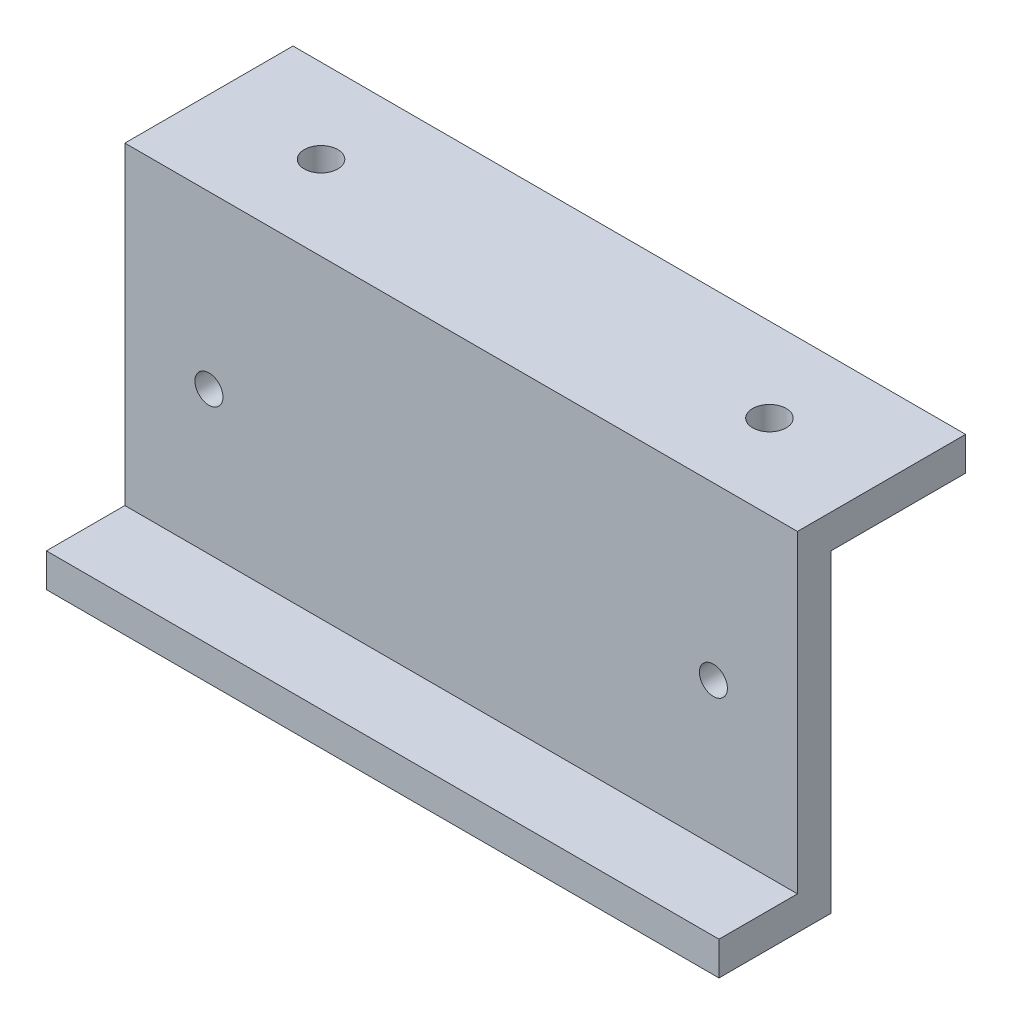
ISO-10303-21;
HEADER;
FILE_DESCRIPTION(('STEP AP214'),'2;1');
FILE_NAME('part.step','',(''),(''),'','','');
FILE_SCHEMA(('AUTOMOTIVE_DESIGN { 1 0 10303 214 1 1 1 1 }'));
ENDSEC;
DATA;
#1=APPLICATION_CONTEXT('core data for automotive mechanical design processes');
#2=APPLICATION_PROTOCOL_DEFINITION('international standard','automotive_design',2000,#1);
#3=PRODUCT_CONTEXT('',#1,'mechanical');
#4=PRODUCT('Part','Part','',(#3));
#5=PRODUCT_RELATED_PRODUCT_CATEGORY('part','',(#4));
#6=PRODUCT_DEFINITION_FORMATION('','',#4);
#7=PRODUCT_DEFINITION_CONTEXT('part definition',#1,'design');
#8=PRODUCT_DEFINITION('design','',#6,#7);
#9=PRODUCT_DEFINITION_SHAPE('','',#8);
#10=(LENGTH_UNIT() NAMED_UNIT(*) SI_UNIT(.MILLI.,.METRE.));
#11=(NAMED_UNIT(*) PLANE_ANGLE_UNIT() SI_UNIT($,.RADIAN.));
#12=(NAMED_UNIT(*) SI_UNIT($,.STERADIAN.) SOLID_ANGLE_UNIT());
#13=UNCERTAINTY_MEASURE_WITH_UNIT(LENGTH_MEASURE(1.E-05),#10,'distance_accuracy_value','');
#14=(GEOMETRIC_REPRESENTATION_CONTEXT(3) GLOBAL_UNCERTAINTY_ASSIGNED_CONTEXT((#13)) GLOBAL_UNIT_ASSIGNED_CONTEXT((#10,
#11,#12)) REPRESENTATION_CONTEXT('',''));
#15=CARTESIAN_POINT('',(0.,0.,0.));
#16=DIRECTION('',(0.,0.,1.));
#17=DIRECTION('',(1.,0.,0.));
#18=AXIS2_PLACEMENT_3D('',#15,#16,#17);
#19=CARTESIAN_POINT('',(0.,0.,3.));
#20=DIRECTION('',(0.,0.,-1.));
#21=DIRECTION('',(-1.,0.,0.));
#22=AXIS2_PLACEMENT_3D('',#19,#20,#21);
#23=PLANE('',#22);
#24=DIRECTION('',(0.,-1.,0.));
#25=VECTOR('',#24,1.);
#26=CARTESIAN_POINT('',(0.,0.,3.));
#27=LINE('',#26,#25);
#28=CARTESIAN_POINT('',(0.,28.,3.));
#29=VERTEX_POINT('',#28);
#30=CARTESIAN_POINT('',(0.,0.,3.));
#31=VERTEX_POINT('',#30);
#32=EDGE_CURVE('E106',#29,#31,#27,.T.);
#33=ORIENTED_EDGE('',*,*,#32,.T.);
#34=DIRECTION('',(1.,0.,0.));
#35=VECTOR('',#34,1.);
#36=CARTESIAN_POINT('',(0.,0.,3.));
#37=LINE('',#36,#35);
#38=CARTESIAN_POINT('',(60.,0.,3.));
#39=VERTEX_POINT('',#38);
#40=EDGE_CURVE('E53',#31,#39,#37,.T.);
#41=ORIENTED_EDGE('',*,*,#40,.T.);
#42=DIRECTION('',(0.,1.,0.));
#43=VECTOR('',#42,1.);
#44=CARTESIAN_POINT('',(60.,0.,3.));
#45=LINE('',#44,#43);
#46=CARTESIAN_POINT('',(60.,28.,3.));
#47=VERTEX_POINT('',#46);
#48=EDGE_CURVE('E11',#39,#47,#45,.T.);
#49=ORIENTED_EDGE('',*,*,#48,.T.);
#50=DIRECTION('',(1.,0.,0.));
#51=VECTOR('',#50,1.);
#52=CARTESIAN_POINT('',(0.,28.,3.));
#53=LINE('',#52,#51);
#54=EDGE_CURVE('E118',#29,#47,#53,.T.);
#55=ORIENTED_EDGE('',*,*,#54,.F.);
#56=EDGE_LOOP('',(#33,#41,#49,#55));
#57=FACE_BOUND('',#56,.T.);
#58=CARTESIAN_POINT('',(7.5,12.75,3.));
#59=DIRECTION('',(0.,0.,1.));
#60=DIRECTION('',(1.,0.,0.));
#61=AXIS2_PLACEMENT_3D('',#58,#59,#60);
#62=CIRCLE('',#61,1.25);
#63=CARTESIAN_POINT('',(8.75,12.75,3.));
#64=VERTEX_POINT('',#63);
#65=EDGE_CURVE('E195',#64,#64,#62,.T.);
#66=ORIENTED_EDGE('',*,*,#65,.F.);
#67=EDGE_LOOP('',(#66));
#68=FACE_BOUND('',#67,.T.);
#69=CARTESIAN_POINT('',(52.5,12.75,3.));
#70=DIRECTION('',(0.,0.,1.));
#71=DIRECTION('',(1.,0.,0.));
#72=AXIS2_PLACEMENT_3D('',#69,#70,#71);
#73=CIRCLE('',#72,1.25000000000001);
#74=CARTESIAN_POINT('',(53.75,12.75,3.));
#75=VERTEX_POINT('',#74);
#76=EDGE_CURVE('E187',#75,#75,#73,.T.);
#77=ORIENTED_EDGE('',*,*,#76,.F.);
#78=EDGE_LOOP('',(#77));
#79=FACE_BOUND('',#78,.T.);
#80=ADVANCED_FACE('F42',(#57,#68,#79),#23,.F.);
#81=CARTESIAN_POINT('',(0.,0.,0.));
#82=DIRECTION('',(0.,0.,-1.));
#83=DIRECTION('',(-1.,0.,0.));
#84=AXIS2_PLACEMENT_3D('',#81,#82,#83);
#85=PLANE('',#84);
#86=CARTESIAN_POINT('',(7.5,12.75,0.));
#87=DIRECTION('',(0.,0.,1.));
#88=DIRECTION('',(1.,0.,0.));
#89=AXIS2_PLACEMENT_3D('',#86,#87,#88);
#90=CIRCLE('',#89,1.25);
#91=CARTESIAN_POINT('',(8.75,12.75,0.));
#92=VERTEX_POINT('',#91);
#93=EDGE_CURVE('E191',#92,#92,#90,.T.);
#94=ORIENTED_EDGE('',*,*,#93,.T.);
#95=EDGE_LOOP('',(#94));
#96=FACE_BOUND('',#95,.T.);
#97=DIRECTION('',(0.,-1.,0.));
#98=VECTOR('',#97,1.);
#99=CARTESIAN_POINT('',(0.,0.,0.));
#100=LINE('',#99,#98);
#101=CARTESIAN_POINT('',(0.,25.,0.));
#102=VERTEX_POINT('',#101);
#103=CARTESIAN_POINT('',(0.,-3.,0.));
#104=VERTEX_POINT('',#103);
#105=EDGE_CURVE('E199',#102,#104,#100,.T.);
#106=ORIENTED_EDGE('',*,*,#105,.F.);
#107=DIRECTION('',(-1.,0.,0.));
#108=VECTOR('',#107,1.);
#109=CARTESIAN_POINT('',(0.,25.,0.));
#110=LINE('',#109,#108);
#111=CARTESIAN_POINT('',(60.,25.,0.));
#112=VERTEX_POINT('',#111);
#113=EDGE_CURVE('E46',#112,#102,#110,.T.);
#114=ORIENTED_EDGE('',*,*,#113,.F.);
#115=DIRECTION('',(0.,1.,0.));
#116=VECTOR('',#115,1.);
#117=CARTESIAN_POINT('',(60.,0.,0.));
#118=LINE('',#117,#116);
#119=CARTESIAN_POINT('',(60.,-3.,0.));
#120=VERTEX_POINT('',#119);
#121=EDGE_CURVE('E206',#120,#112,#118,.T.);
#122=ORIENTED_EDGE('',*,*,#121,.F.);
#123=DIRECTION('',(1.,0.,0.));
#124=VECTOR('',#123,1.);
#125=CARTESIAN_POINT('',(0.,-3.,0.));
#126=LINE('',#125,#124);
#127=EDGE_CURVE('E162',#104,#120,#126,.T.);
#128=ORIENTED_EDGE('',*,*,#127,.F.);
#129=EDGE_LOOP('',(#106,#114,#122,#128));
#130=FACE_BOUND('',#129,.T.);
#131=CARTESIAN_POINT('',(52.5,12.75,0.));
#132=DIRECTION('',(0.,0.,1.));
#133=DIRECTION('',(1.,0.,0.));
#134=AXIS2_PLACEMENT_3D('',#131,#132,#133);
#135=CIRCLE('',#134,1.25000000000001);
#136=CARTESIAN_POINT('',(53.75,12.75,0.));
#137=VERTEX_POINT('',#136);
#138=EDGE_CURVE('E186',#137,#137,#135,.T.);
#139=ORIENTED_EDGE('',*,*,#138,.T.);
#140=EDGE_LOOP('',(#139));
#141=FACE_BOUND('',#140,.T.);
#142=ADVANCED_FACE('F245',(#96,#130,#141),#85,.T.);
#143=CARTESIAN_POINT('',(0.,0.,3.));
#144=DIRECTION('',(1.,0.,0.));
#145=DIRECTION('',(0.,0.,-1.));
#146=AXIS2_PLACEMENT_3D('',#143,#144,#145);
#147=PLANE('',#146);
#148=ORIENTED_EDGE('',*,*,#105,.T.);
#149=DIRECTION('',(0.,0.,-1.));
#150=VECTOR('',#149,1.);
#151=CARTESIAN_POINT('',(0.,-3.,0.));
#152=LINE('',#151,#150);
#153=CARTESIAN_POINT('',(0.,-3.,10.));
#154=VERTEX_POINT('',#153);
#155=EDGE_CURVE('E158',#154,#104,#152,.T.);
#156=ORIENTED_EDGE('',*,*,#155,.F.);
#157=DIRECTION('',(0.,1.,0.));
#158=VECTOR('',#157,1.);
#159=CARTESIAN_POINT('',(0.,-3.,10.));
#160=LINE('',#159,#158);
#161=CARTESIAN_POINT('',(0.,0.,10.));
#162=VERTEX_POINT('',#161);
#163=EDGE_CURVE('E173',#154,#162,#160,.T.);
#164=ORIENTED_EDGE('',*,*,#163,.T.);
#165=DIRECTION('',(0.,0.,-1.));
#166=VECTOR('',#165,1.);
#167=CARTESIAN_POINT('',(0.,0.,0.));
#168=LINE('',#167,#166);
#169=EDGE_CURVE('E113',#162,#31,#168,.T.);
#170=ORIENTED_EDGE('',*,*,#169,.T.);
#171=ORIENTED_EDGE('',*,*,#32,.F.);
#172=DIRECTION('',(0.,0.,1.));
#173=VECTOR('',#172,1.);
#174=CARTESIAN_POINT('',(0.,28.,3.));
#175=LINE('',#174,#173);
#176=CARTESIAN_POINT('',(0.,28.,-12.));
#177=VERTEX_POINT('',#176);
#178=EDGE_CURVE('E110',#177,#29,#175,.T.);
#179=ORIENTED_EDGE('',*,*,#178,.F.);
#180=DIRECTION('',(0.,-1.,0.));
#181=VECTOR('',#180,1.);
#182=CARTESIAN_POINT('',(0.,28.,-12.));
#183=LINE('',#182,#181);
#184=CARTESIAN_POINT('',(0.,25.,-12.));
#185=VERTEX_POINT('',#184);
#186=EDGE_CURVE('E144',#177,#185,#183,.T.);
#187=ORIENTED_EDGE('',*,*,#186,.T.);
#188=DIRECTION('',(0.,0.,1.));
#189=VECTOR('',#188,1.);
#190=CARTESIAN_POINT('',(0.,25.,3.));
#191=LINE('',#190,#189);
#192=EDGE_CURVE('E145',#185,#102,#191,.T.);
#193=ORIENTED_EDGE('',*,*,#192,.T.);
#194=EDGE_LOOP('',(#148,#156,#164,#170,#171,#179,#187,#193));
#195=FACE_BOUND('',#194,.T.);
#196=ADVANCED_FACE('F44',(#195),#147,.F.);
#197=CARTESIAN_POINT('',(60.,0.,3.));
#198=DIRECTION('',(-1.,0.,0.));
#199=DIRECTION('',(0.,0.,1.));
#200=AXIS2_PLACEMENT_3D('',#197,#198,#199);
#201=PLANE('',#200);
#202=ORIENTED_EDGE('',*,*,#121,.T.);
#203=DIRECTION('',(0.,0.,-1.));
#204=VECTOR('',#203,1.);
#205=CARTESIAN_POINT('',(60.,25.,3.));
#206=LINE('',#205,#204);
#207=CARTESIAN_POINT('',(60.,25.,-12.));
#208=VERTEX_POINT('',#207);
#209=EDGE_CURVE('E134',#112,#208,#206,.T.);
#210=ORIENTED_EDGE('',*,*,#209,.T.);
#211=DIRECTION('',(0.,-1.,0.));
#212=VECTOR('',#211,1.);
#213=CARTESIAN_POINT('',(60.,28.,-12.));
#214=LINE('',#213,#212);
#215=CARTESIAN_POINT('',(60.,28.,-12.));
#216=VERTEX_POINT('',#215);
#217=EDGE_CURVE('E154',#216,#208,#214,.T.);
#218=ORIENTED_EDGE('',*,*,#217,.F.);
#219=DIRECTION('',(0.,0.,-1.));
#220=VECTOR('',#219,1.);
#221=CARTESIAN_POINT('',(60.,28.,3.));
#222=LINE('',#221,#220);
#223=EDGE_CURVE('E124',#47,#216,#222,.T.);
#224=ORIENTED_EDGE('',*,*,#223,.F.);
#225=ORIENTED_EDGE('',*,*,#48,.F.);
#226=DIRECTION('',(0.,0.,1.));
#227=VECTOR('',#226,1.);
#228=CARTESIAN_POINT('',(60.,0.,0.));
#229=LINE('',#228,#227);
#230=CARTESIAN_POINT('',(60.,0.,10.));
#231=VERTEX_POINT('',#230);
#232=EDGE_CURVE('E60',#39,#231,#229,.T.);
#233=ORIENTED_EDGE('',*,*,#232,.T.);
#234=DIRECTION('',(0.,1.,0.));
#235=VECTOR('',#234,1.);
#236=CARTESIAN_POINT('',(60.,-3.,10.));
#237=LINE('',#236,#235);
#238=CARTESIAN_POINT('',(60.,-3.,10.));
#239=VERTEX_POINT('',#238);
#240=EDGE_CURVE('E182',#239,#231,#237,.T.);
#241=ORIENTED_EDGE('',*,*,#240,.F.);
#242=DIRECTION('',(0.,0.,1.));
#243=VECTOR('',#242,1.);
#244=CARTESIAN_POINT('',(60.,-3.,0.));
#245=LINE('',#244,#243);
#246=EDGE_CURVE('E167',#120,#239,#245,.T.);
#247=ORIENTED_EDGE('',*,*,#246,.F.);
#248=EDGE_LOOP('',(#202,#210,#218,#224,#225,#233,#241,#247));
#249=FACE_BOUND('',#248,.T.);
#250=ADVANCED_FACE('F224',(#249),#201,.F.);
#251=CARTESIAN_POINT('',(7.5,12.75,3.));
#252=DIRECTION('',(0.,0.,-1.));
#253=DIRECTION('',(-1.,0.,0.));
#254=AXIS2_PLACEMENT_3D('',#251,#252,#253);
#255=CYLINDRICAL_SURFACE('',#254,1.25);
#256=ORIENTED_EDGE('',*,*,#65,.T.);
#257=EDGE_LOOP('',(#256));
#258=FACE_BOUND('',#257,.T.);
#259=ORIENTED_EDGE('',*,*,#93,.F.);
#260=EDGE_LOOP('',(#259));
#261=FACE_BOUND('',#260,.T.);
#262=ADVANCED_FACE('F240',(#258,#261),#255,.F.);
#263=CARTESIAN_POINT('',(52.5,12.75,3.));
#264=DIRECTION('',(0.,0.,-1.));
#265=DIRECTION('',(-1.,0.,0.));
#266=AXIS2_PLACEMENT_3D('',#263,#264,#265);
#267=CYLINDRICAL_SURFACE('',#266,1.25000000000001);
#268=ORIENTED_EDGE('',*,*,#76,.T.);
#269=EDGE_LOOP('',(#268));
#270=FACE_BOUND('',#269,.T.);
#271=ORIENTED_EDGE('',*,*,#138,.F.);
#272=EDGE_LOOP('',(#271));
#273=FACE_BOUND('',#272,.T.);
#274=ADVANCED_FACE('F232',(#270,#273),#267,.F.);
#275=CARTESIAN_POINT('',(0.,0.,0.));
#276=DIRECTION('',(0.,1.,0.));
#277=DIRECTION('',(0.,0.,1.));
#278=AXIS2_PLACEMENT_3D('',#275,#276,#277);
#279=PLANE('',#278);
#280=ORIENTED_EDGE('',*,*,#40,.F.);
#281=ORIENTED_EDGE('',*,*,#169,.F.);
#282=DIRECTION('',(-1.,0.,0.));
#283=VECTOR('',#282,1.);
#284=CARTESIAN_POINT('',(0.,0.,10.));
#285=LINE('',#284,#283);
#286=EDGE_CURVE('E163',#231,#162,#285,.T.);
#287=ORIENTED_EDGE('',*,*,#286,.F.);
#288=ORIENTED_EDGE('',*,*,#232,.F.);
#289=EDGE_LOOP('',(#280,#281,#287,#288));
#290=FACE_BOUND('',#289,.T.);
#291=ADVANCED_FACE('F230',(#290),#279,.T.);
#292=CARTESIAN_POINT('',(0.,-3.,10.));
#293=DIRECTION('',(0.,0.,-1.));
#294=DIRECTION('',(-1.,0.,0.));
#295=AXIS2_PLACEMENT_3D('',#292,#293,#294);
#296=PLANE('',#295);
#297=ORIENTED_EDGE('',*,*,#286,.T.);
#298=ORIENTED_EDGE('',*,*,#163,.F.);
#299=DIRECTION('',(-1.,0.,0.));
#300=VECTOR('',#299,1.);
#301=CARTESIAN_POINT('',(0.,-3.,10.));
#302=LINE('',#301,#300);
#303=EDGE_CURVE('E170',#239,#154,#302,.T.);
#304=ORIENTED_EDGE('',*,*,#303,.F.);
#305=ORIENTED_EDGE('',*,*,#240,.T.);
#306=EDGE_LOOP('',(#297,#298,#304,#305));
#307=FACE_BOUND('',#306,.T.);
#308=ADVANCED_FACE('F228',(#307),#296,.F.);
#309=CARTESIAN_POINT('',(0.,-3.,0.));
#310=DIRECTION('',(0.,1.,0.));
#311=DIRECTION('',(0.,0.,1.));
#312=AXIS2_PLACEMENT_3D('',#309,#310,#311);
#313=PLANE('',#312);
#314=ORIENTED_EDGE('',*,*,#155,.T.);
#315=ORIENTED_EDGE('',*,*,#127,.T.);
#316=ORIENTED_EDGE('',*,*,#246,.T.);
#317=ORIENTED_EDGE('',*,*,#303,.T.);
#318=EDGE_LOOP('',(#314,#315,#316,#317));
#319=FACE_BOUND('',#318,.T.);
#320=ADVANCED_FACE('F238',(#319),#313,.F.);
#321=CARTESIAN_POINT('',(0.,28.,-12.));
#322=DIRECTION('',(0.,0.,1.));
#323=DIRECTION('',(1.,0.,0.));
#324=AXIS2_PLACEMENT_3D('',#321,#322,#323);
#325=PLANE('',#324);
#326=DIRECTION('',(-1.,0.,0.));
#327=VECTOR('',#326,1.);
#328=CARTESIAN_POINT('',(0.,25.,-12.));
#329=LINE('',#328,#327);
#330=EDGE_CURVE('E131',#208,#185,#329,.T.);
#331=ORIENTED_EDGE('',*,*,#330,.T.);
#332=ORIENTED_EDGE('',*,*,#186,.F.);
#333=DIRECTION('',(-1.,0.,0.));
#334=VECTOR('',#333,1.);
#335=CARTESIAN_POINT('',(0.,28.,-12.));
#336=LINE('',#335,#334);
#337=EDGE_CURVE('E128',#216,#177,#336,.T.);
#338=ORIENTED_EDGE('',*,*,#337,.F.);
#339=ORIENTED_EDGE('',*,*,#217,.T.);
#340=EDGE_LOOP('',(#331,#332,#338,#339));
#341=FACE_BOUND('',#340,.T.);
#342=ADVANCED_FACE('F222',(#341),#325,.F.);
#343=CARTESIAN_POINT('',(0.,28.,0.));
#344=DIRECTION('',(0.,-1.,0.));
#345=DIRECTION('',(0.,0.,-1.));
#346=AXIS2_PLACEMENT_3D('',#343,#344,#345);
#347=PLANE('',#346);
#348=CARTESIAN_POINT('',(10.,28.,-4.5));
#349=DIRECTION('',(0.,1.,0.));
#350=DIRECTION('',(0.,0.,1.));
#351=AXIS2_PLACEMENT_3D('',#348,#349,#350);
#352=CIRCLE('',#351,1.5);
#353=CARTESIAN_POINT('',(10.,28.,-3.));
#354=VERTEX_POINT('',#353);
#355=EDGE_CURVE('E402',#354,#354,#352,.T.);
#356=ORIENTED_EDGE('',*,*,#355,.F.);
#357=EDGE_LOOP('',(#356));
#358=FACE_BOUND('',#357,.T.);
#359=CARTESIAN_POINT('',(50.,28.,-4.5));
#360=DIRECTION('',(0.,1.,0.));
#361=DIRECTION('',(0.,0.,1.));
#362=AXIS2_PLACEMENT_3D('',#359,#360,#361);
#363=CIRCLE('',#362,1.5);
#364=CARTESIAN_POINT('',(50.,28.,-3.));
#365=VERTEX_POINT('',#364);
#366=EDGE_CURVE('E404',#365,#365,#363,.T.);
#367=ORIENTED_EDGE('',*,*,#366,.F.);
#368=EDGE_LOOP('',(#367));
#369=FACE_BOUND('',#368,.T.);
#370=ORIENTED_EDGE('',*,*,#178,.T.);
#371=ORIENTED_EDGE('',*,*,#54,.T.);
#372=ORIENTED_EDGE('',*,*,#223,.T.);
#373=ORIENTED_EDGE('',*,*,#337,.T.);
#374=EDGE_LOOP('',(#370,#371,#372,#373));
#375=FACE_BOUND('',#374,.T.);
#376=ADVANCED_FACE('F126',(#358,#369,#375),#347,.F.);
#377=CARTESIAN_POINT('',(0.,25.,0.));
#378=DIRECTION('',(0.,-1.,0.));
#379=DIRECTION('',(0.,0.,-1.));
#380=AXIS2_PLACEMENT_3D('',#377,#378,#379);
#381=PLANE('',#380);
#382=CARTESIAN_POINT('',(10.,25.,-4.5));
#383=DIRECTION('',(0.,1.,0.));
#384=DIRECTION('',(0.,0.,1.));
#385=AXIS2_PLACEMENT_3D('',#382,#383,#384);
#386=CIRCLE('',#385,1.5);
#387=CARTESIAN_POINT('',(10.,25.,-3.));
#388=VERTEX_POINT('',#387);
#389=EDGE_CURVE('E149',#388,#388,#386,.T.);
#390=ORIENTED_EDGE('',*,*,#389,.T.);
#391=EDGE_LOOP('',(#390));
#392=FACE_BOUND('',#391,.T.);
#393=CARTESIAN_POINT('',(50.,25.,-4.5));
#394=DIRECTION('',(0.,1.,0.));
#395=DIRECTION('',(0.,0.,1.));
#396=AXIS2_PLACEMENT_3D('',#393,#394,#395);
#397=CIRCLE('',#396,1.5);
#398=CARTESIAN_POINT('',(50.,25.,-3.));
#399=VERTEX_POINT('',#398);
#400=EDGE_CURVE('E137',#399,#399,#397,.T.);
#401=ORIENTED_EDGE('',*,*,#400,.T.);
#402=EDGE_LOOP('',(#401));
#403=FACE_BOUND('',#402,.T.);
#404=ORIENTED_EDGE('',*,*,#209,.F.);
#405=ORIENTED_EDGE('',*,*,#113,.T.);
#406=ORIENTED_EDGE('',*,*,#192,.F.);
#407=ORIENTED_EDGE('',*,*,#330,.F.);
#408=EDGE_LOOP('',(#404,#405,#406,#407));
#409=FACE_BOUND('',#408,.T.);
#410=ADVANCED_FACE('F216',(#392,#403,#409),#381,.T.);
#411=CARTESIAN_POINT('',(50.,25.,-4.5));
#412=DIRECTION('',(0.,1.,0.));
#413=DIRECTION('',(0.,0.,1.));
#414=AXIS2_PLACEMENT_3D('',#411,#412,#413);
#415=CYLINDRICAL_SURFACE('',#414,1.5);
#416=ORIENTED_EDGE('',*,*,#400,.F.);
#417=EDGE_LOOP('',(#416));
#418=FACE_BOUND('',#417,.T.);
#419=ORIENTED_EDGE('',*,*,#366,.T.);
#420=EDGE_LOOP('',(#419));
#421=FACE_BOUND('',#420,.T.);
#422=ADVANCED_FACE('F367',(#418,#421),#415,.F.);
#423=CARTESIAN_POINT('',(10.,25.,-4.5));
#424=DIRECTION('',(0.,1.,0.));
#425=DIRECTION('',(0.,0.,1.));
#426=AXIS2_PLACEMENT_3D('',#423,#424,#425);
#427=CYLINDRICAL_SURFACE('',#426,1.5);
#428=ORIENTED_EDGE('',*,*,#389,.F.);
#429=EDGE_LOOP('',(#428));
#430=FACE_BOUND('',#429,.T.);
#431=ORIENTED_EDGE('',*,*,#355,.T.);
#432=EDGE_LOOP('',(#431));
#433=FACE_BOUND('',#432,.T.);
#434=ADVANCED_FACE('F378',(#430,#433),#427,.F.);
#435=CLOSED_SHELL('',(#80,#142,#196,#250,#262,#274,#291,#308,#320,#342,#376,#410,#422,#434));
#436=MANIFOLD_SOLID_BREP('B2',#435);
#437=ADVANCED_BREP_SHAPE_REPRESENTATION('',(#18,#436),#14);
#438=SHAPE_DEFINITION_REPRESENTATION(#9,#437);
ENDSEC;
END-ISO-10303-21;
